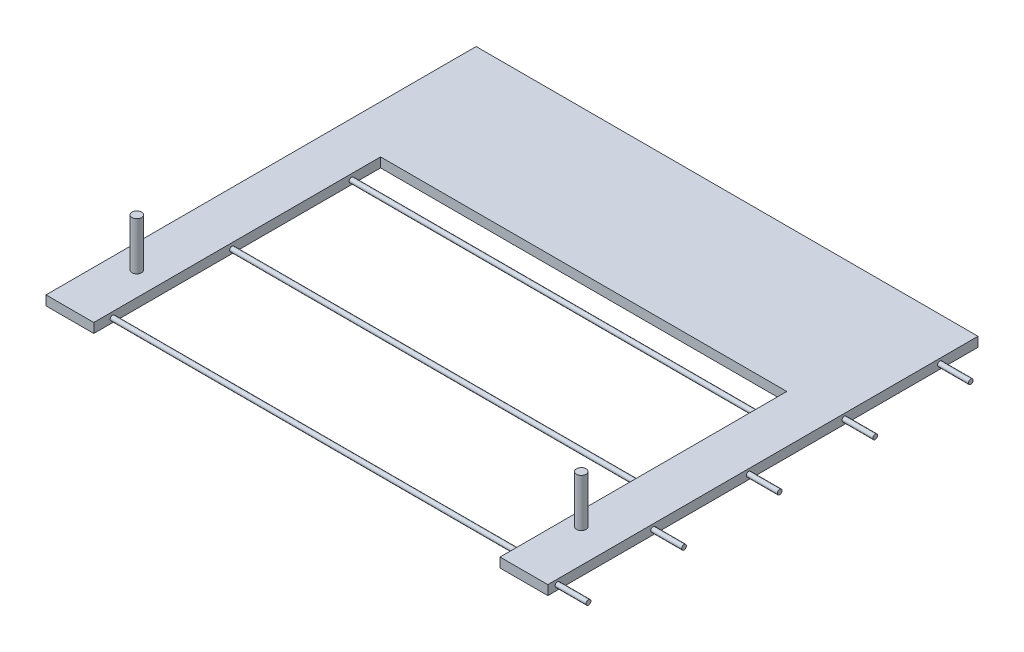
ISO-10303-21;
HEADER;
FILE_DESCRIPTION(('STEP AP214'),'2;1');
FILE_NAME('part.step','',(''),(''),'','','');
FILE_SCHEMA(('AUTOMOTIVE_DESIGN { 1 0 10303 214 1 1 1 1 }'));
ENDSEC;
DATA;
#1=APPLICATION_CONTEXT('core data for automotive mechanical design processes');
#2=APPLICATION_PROTOCOL_DEFINITION('international standard','automotive_design',2000,#1);
#3=PRODUCT_CONTEXT('',#1,'mechanical');
#4=PRODUCT('Part','Part','',(#3));
#5=PRODUCT_RELATED_PRODUCT_CATEGORY('part','',(#4));
#6=PRODUCT_DEFINITION_FORMATION('','',#4);
#7=PRODUCT_DEFINITION_CONTEXT('part definition',#1,'design');
#8=PRODUCT_DEFINITION('design','',#6,#7);
#9=PRODUCT_DEFINITION_SHAPE('','',#8);
#10=(LENGTH_UNIT() NAMED_UNIT(*) SI_UNIT(.MILLI.,.METRE.));
#11=(NAMED_UNIT(*) PLANE_ANGLE_UNIT() SI_UNIT($,.RADIAN.));
#12=(NAMED_UNIT(*) SI_UNIT($,.STERADIAN.) SOLID_ANGLE_UNIT());
#13=UNCERTAINTY_MEASURE_WITH_UNIT(LENGTH_MEASURE(1.E-05),#10,'distance_accuracy_value','');
#14=(GEOMETRIC_REPRESENTATION_CONTEXT(3) GLOBAL_UNCERTAINTY_ASSIGNED_CONTEXT((#13)) GLOBAL_UNIT_ASSIGNED_CONTEXT((#10,
#11,#12)) REPRESENTATION_CONTEXT('',''));
#15=CARTESIAN_POINT('',(0.,0.,0.));
#16=DIRECTION('',(0.,0.,1.));
#17=DIRECTION('',(1.,0.,0.));
#18=AXIS2_PLACEMENT_3D('',#15,#16,#17);
#19=CARTESIAN_POINT('',(-52.5,2.,50.));
#20=DIRECTION('',(0.,0.,-1.));
#21=DIRECTION('',(-1.,0.,0.));
#22=AXIS2_PLACEMENT_3D('',#19,#20,#21);
#23=PLANE('',#22);
#24=DIRECTION('',(0.,1.,0.));
#25=VECTOR('',#24,1.);
#26=CARTESIAN_POINT('',(-42.5,0.,50.));
#27=LINE('',#26,#25);
#28=CARTESIAN_POINT('',(-42.5,0.,50.));
#29=VERTEX_POINT('',#28);
#30=CARTESIAN_POINT('',(-42.5,2.,50.));
#31=VERTEX_POINT('',#30);
#32=EDGE_CURVE('E196',#29,#31,#27,.T.);
#33=ORIENTED_EDGE('',*,*,#32,.T.);
#34=DIRECTION('',(1.,0.,0.));
#35=VECTOR('',#34,1.);
#36=CARTESIAN_POINT('',(-52.5,2.,50.));
#37=LINE('',#36,#35);
#38=CARTESIAN_POINT('',(-52.5,2.,50.));
#39=VERTEX_POINT('',#38);
#40=EDGE_CURVE('E129',#39,#31,#37,.T.);
#41=ORIENTED_EDGE('',*,*,#40,.F.);
#42=DIRECTION('',(0.,-1.,0.));
#43=VECTOR('',#42,1.);
#44=CARTESIAN_POINT('',(-52.5,2.,50.));
#45=LINE('',#44,#43);
#46=CARTESIAN_POINT('',(-52.5,0.,50.));
#47=VERTEX_POINT('',#46);
#48=EDGE_CURVE('E110',#39,#47,#45,.T.);
#49=ORIENTED_EDGE('',*,*,#48,.T.);
#50=DIRECTION('',(1.,0.,0.));
#51=VECTOR('',#50,1.);
#52=CARTESIAN_POINT('',(-52.5,0.,50.));
#53=LINE('',#52,#51);
#54=EDGE_CURVE('E131',#47,#29,#53,.T.);
#55=ORIENTED_EDGE('',*,*,#54,.T.);
#56=EDGE_LOOP('',(#33,#41,#49,#55));
#57=FACE_BOUND('',#56,.T.);
#58=ADVANCED_FACE('F39',(#57),#23,.F.);
#59=CARTESIAN_POINT('',(0.,2.,0.));
#60=DIRECTION('',(0.,1.,0.));
#61=DIRECTION('',(0.,0.,1.));
#62=AXIS2_PLACEMENT_3D('',#59,#60,#61);
#63=PLANE('',#62);
#64=DIRECTION('',(1.,0.,0.));
#65=VECTOR('',#64,1.);
#66=CARTESIAN_POINT('',(0.,2.,-40.));
#67=LINE('',#66,#65);
#68=CARTESIAN_POINT('',(-52.5,2.,-40.));
#69=VERTEX_POINT('',#68);
#70=CARTESIAN_POINT('',(52.5,2.,-40.));
#71=VERTEX_POINT('',#70);
#72=EDGE_CURVE('E104',#69,#71,#67,.T.);
#73=ORIENTED_EDGE('',*,*,#72,.F.);
#74=DIRECTION('',(0.,0.,1.));
#75=VECTOR('',#74,1.);
#76=CARTESIAN_POINT('',(-52.5,2.,-50.));
#77=LINE('',#76,#75);
#78=EDGE_CURVE('E117',#69,#39,#77,.T.);
#79=ORIENTED_EDGE('',*,*,#78,.T.);
#80=ORIENTED_EDGE('',*,*,#40,.T.);
#81=DIRECTION('',(0.,0.,-1.));
#82=VECTOR('',#81,1.);
#83=CARTESIAN_POINT('',(-42.5,2.,50.));
#84=LINE('',#83,#82);
#85=CARTESIAN_POINT('',(-42.5,2.,-10.));
#86=VERTEX_POINT('',#85);
#87=EDGE_CURVE('E187',#31,#86,#84,.T.);
#88=ORIENTED_EDGE('',*,*,#87,.T.);
#89=DIRECTION('',(1.,0.,0.));
#90=VECTOR('',#89,1.);
#91=CARTESIAN_POINT('',(-42.5,2.,-10.));
#92=LINE('',#91,#90);
#93=CARTESIAN_POINT('',(42.5,2.,-10.));
#94=VERTEX_POINT('',#93);
#95=EDGE_CURVE('E184',#86,#94,#92,.T.);
#96=ORIENTED_EDGE('',*,*,#95,.T.);
#97=DIRECTION('',(0.,0.,-1.));
#98=VECTOR('',#97,1.);
#99=CARTESIAN_POINT('',(42.5,2.,50.));
#100=LINE('',#99,#98);
#101=CARTESIAN_POINT('',(42.5,2.,50.));
#102=VERTEX_POINT('',#101);
#103=EDGE_CURVE('E178',#102,#94,#100,.T.);
#104=ORIENTED_EDGE('',*,*,#103,.F.);
#105=CARTESIAN_POINT('',(52.5,2.,50.));
#106=VERTEX_POINT('',#105);
#107=EDGE_CURVE('E127',#102,#106,#37,.T.);
#108=ORIENTED_EDGE('',*,*,#107,.T.);
#109=DIRECTION('',(0.,0.,-1.));
#110=VECTOR('',#109,1.);
#111=CARTESIAN_POINT('',(52.5,2.,-50.));
#112=LINE('',#111,#110);
#113=EDGE_CURVE('E120',#106,#71,#112,.T.);
#114=ORIENTED_EDGE('',*,*,#113,.T.);
#115=EDGE_LOOP('',(#73,#79,#80,#88,#96,#104,#108,#114));
#116=FACE_BOUND('',#115,.T.);
#117=CARTESIAN_POINT('',(-47.5,2.,36.));
#118=DIRECTION('',(0.,1.,0.));
#119=DIRECTION('',(0.,0.,1.));
#120=AXIS2_PLACEMENT_3D('',#117,#118,#119);
#121=CIRCLE('',#120,0.999999999999998);
#122=CARTESIAN_POINT('',(-47.5,2.,37.));
#123=VERTEX_POINT('',#122);
#124=EDGE_CURVE('E217',#123,#123,#121,.T.);
#125=ORIENTED_EDGE('',*,*,#124,.F.);
#126=EDGE_LOOP('',(#125));
#127=FACE_BOUND('',#126,.T.);
#128=CARTESIAN_POINT('',(45.5,2.,36.0000000000002));
#129=DIRECTION('',(0.,1.,0.));
#130=DIRECTION('',(0.,0.,1.));
#131=AXIS2_PLACEMENT_3D('',#128,#129,#130);
#132=CIRCLE('',#131,0.999999999999998);
#133=CARTESIAN_POINT('',(45.5,2.,37.0000000000002));
#134=VERTEX_POINT('',#133);
#135=EDGE_CURVE('E214',#134,#134,#132,.T.);
#136=ORIENTED_EDGE('',*,*,#135,.F.);
#137=EDGE_LOOP('',(#136));
#138=FACE_BOUND('',#137,.T.);
#139=ADVANCED_FACE('F114',(#116,#127,#138),#63,.T.);
#140=CARTESIAN_POINT('',(0.,0.,0.));
#141=DIRECTION('',(0.,1.,0.));
#142=DIRECTION('',(0.,0.,1.));
#143=AXIS2_PLACEMENT_3D('',#140,#141,#142);
#144=PLANE('',#143);
#145=DIRECTION('',(0.,0.,1.));
#146=VECTOR('',#145,1.);
#147=CARTESIAN_POINT('',(-52.5,0.,-50.));
#148=LINE('',#147,#146);
#149=CARTESIAN_POINT('',(-52.5,0.,-40.));
#150=VERTEX_POINT('',#149);
#151=EDGE_CURVE('E139',#150,#47,#148,.T.);
#152=ORIENTED_EDGE('',*,*,#151,.F.);
#153=DIRECTION('',(1.,0.,0.));
#154=VECTOR('',#153,1.);
#155=CARTESIAN_POINT('',(0.,0.,-40.));
#156=LINE('',#155,#154);
#157=CARTESIAN_POINT('',(52.5,0.,-40.));
#158=VERTEX_POINT('',#157);
#159=EDGE_CURVE('E54',#150,#158,#156,.T.);
#160=ORIENTED_EDGE('',*,*,#159,.T.);
#161=DIRECTION('',(0.,0.,-1.));
#162=VECTOR('',#161,1.);
#163=CARTESIAN_POINT('',(52.5,0.,-50.));
#164=LINE('',#163,#162);
#165=CARTESIAN_POINT('',(52.5,0.,50.));
#166=VERTEX_POINT('',#165);
#167=EDGE_CURVE('E136',#166,#158,#164,.T.);
#168=ORIENTED_EDGE('',*,*,#167,.F.);
#169=CARTESIAN_POINT('',(42.5,0.,50.));
#170=VERTEX_POINT('',#169);
#171=EDGE_CURVE('E142',#170,#166,#53,.T.);
#172=ORIENTED_EDGE('',*,*,#171,.F.);
#173=DIRECTION('',(0.,0.,-1.));
#174=VECTOR('',#173,1.);
#175=CARTESIAN_POINT('',(42.5,0.,50.));
#176=LINE('',#175,#174);
#177=CARTESIAN_POINT('',(42.5,0.,-10.));
#178=VERTEX_POINT('',#177);
#179=EDGE_CURVE('E199',#170,#178,#176,.T.);
#180=ORIENTED_EDGE('',*,*,#179,.T.);
#181=DIRECTION('',(1.,0.,0.));
#182=VECTOR('',#181,1.);
#183=CARTESIAN_POINT('',(-42.5,0.,-10.));
#184=LINE('',#183,#182);
#185=CARTESIAN_POINT('',(-42.5,0.,-10.));
#186=VERTEX_POINT('',#185);
#187=EDGE_CURVE('E205',#186,#178,#184,.T.);
#188=ORIENTED_EDGE('',*,*,#187,.F.);
#189=DIRECTION('',(0.,0.,-1.));
#190=VECTOR('',#189,1.);
#191=CARTESIAN_POINT('',(-42.5,0.,50.));
#192=LINE('',#191,#190);
#193=EDGE_CURVE('E183',#29,#186,#192,.T.);
#194=ORIENTED_EDGE('',*,*,#193,.F.);
#195=ORIENTED_EDGE('',*,*,#54,.F.);
#196=EDGE_LOOP('',(#152,#160,#168,#172,#180,#188,#194,#195));
#197=FACE_BOUND('',#196,.T.);
#198=ADVANCED_FACE('F208',(#197),#144,.F.);
#199=CARTESIAN_POINT('',(52.5,2.,-50.));
#200=DIRECTION('',(-1.,0.,0.));
#201=DIRECTION('',(0.,0.,1.));
#202=AXIS2_PLACEMENT_3D('',#199,#200,#201);
#203=PLANE('',#202);
#204=CARTESIAN_POINT('',(52.5,1.,-32.0279323631784));
#205=DIRECTION('',(-1.,0.,0.));
#206=DIRECTION('',(0.,0.,1.));
#207=AXIS2_PLACEMENT_3D('',#204,#205,#206);
#208=CIRCLE('',#207,0.499999999999999);
#209=CARTESIAN_POINT('',(52.5,1.,-31.5279323631784));
#210=VERTEX_POINT('',#209);
#211=EDGE_CURVE('E159',#210,#210,#208,.F.);
#212=ORIENTED_EDGE('',*,*,#211,.F.);
#213=EDGE_LOOP('',(#212));
#214=FACE_BOUND('',#213,.T.);
#215=CARTESIAN_POINT('',(52.5,1.,-12.0279323631784));
#216=DIRECTION('',(-1.,0.,0.));
#217=DIRECTION('',(0.,0.,1.));
#218=AXIS2_PLACEMENT_3D('',#215,#216,#217);
#219=CIRCLE('',#218,0.499999999999999);
#220=CARTESIAN_POINT('',(52.5,1.,-11.5279323631784));
#221=VERTEX_POINT('',#220);
#222=EDGE_CURVE('E156',#221,#221,#219,.F.);
#223=ORIENTED_EDGE('',*,*,#222,.F.);
#224=EDGE_LOOP('',(#223));
#225=FACE_BOUND('',#224,.T.);
#226=CARTESIAN_POINT('',(52.5,1.,7.97206763682163));
#227=DIRECTION('',(-1.,0.,0.));
#228=DIRECTION('',(0.,0.,1.));
#229=AXIS2_PLACEMENT_3D('',#226,#227,#228);
#230=CIRCLE('',#229,0.5);
#231=CARTESIAN_POINT('',(52.5,1.,8.47206763682163));
#232=VERTEX_POINT('',#231);
#233=EDGE_CURVE('E153',#232,#232,#230,.F.);
#234=ORIENTED_EDGE('',*,*,#233,.F.);
#235=EDGE_LOOP('',(#234));
#236=FACE_BOUND('',#235,.T.);
#237=CARTESIAN_POINT('',(52.5,1.,27.9720676368216));
#238=DIRECTION('',(-1.,0.,0.));
#239=DIRECTION('',(0.,0.,1.));
#240=AXIS2_PLACEMENT_3D('',#237,#238,#239);
#241=CIRCLE('',#240,0.499999999999999);
#242=CARTESIAN_POINT('',(52.5,1.,28.4720676368216));
#243=VERTEX_POINT('',#242);
#244=EDGE_CURVE('E150',#243,#243,#241,.F.);
#245=ORIENTED_EDGE('',*,*,#244,.F.);
#246=EDGE_LOOP('',(#245));
#247=FACE_BOUND('',#246,.T.);
#248=CARTESIAN_POINT('',(52.5,1.,47.9720676368216));
#249=DIRECTION('',(-1.,0.,0.));
#250=DIRECTION('',(0.,0.,1.));
#251=AXIS2_PLACEMENT_3D('',#248,#249,#250);
#252=CIRCLE('',#251,0.499999999999999);
#253=CARTESIAN_POINT('',(52.5,1.,48.4720676368216));
#254=VERTEX_POINT('',#253);
#255=EDGE_CURVE('E109',#254,#254,#252,.F.);
#256=ORIENTED_EDGE('',*,*,#255,.F.);
#257=EDGE_LOOP('',(#256));
#258=FACE_BOUND('',#257,.T.);
#259=ORIENTED_EDGE('',*,*,#167,.T.);
#260=DIRECTION('',(0.,1.,0.));
#261=VECTOR('',#260,1.);
#262=CARTESIAN_POINT('',(52.5,-8.,-40.));
#263=LINE('',#262,#261);
#264=EDGE_CURVE('E121',#158,#71,#263,.T.);
#265=ORIENTED_EDGE('',*,*,#264,.T.);
#266=ORIENTED_EDGE('',*,*,#113,.F.);
#267=DIRECTION('',(0.,-1.,0.));
#268=VECTOR('',#267,1.);
#269=CARTESIAN_POINT('',(52.5,2.,50.));
#270=LINE('',#269,#268);
#271=EDGE_CURVE('E135',#106,#166,#270,.T.);
#272=ORIENTED_EDGE('',*,*,#271,.T.);
#273=EDGE_LOOP('',(#259,#265,#266,#272));
#274=FACE_BOUND('',#273,.T.);
#275=ADVANCED_FACE('F41',(#214,#225,#236,#247,#258,#274),#203,.F.);
#276=CARTESIAN_POINT('',(-52.5,2.,-50.));
#277=DIRECTION('',(1.,0.,0.));
#278=DIRECTION('',(0.,0.,-1.));
#279=AXIS2_PLACEMENT_3D('',#276,#277,#278);
#280=PLANE('',#279);
#281=ORIENTED_EDGE('',*,*,#78,.F.);
#282=DIRECTION('',(0.,-1.,0.));
#283=VECTOR('',#282,1.);
#284=CARTESIAN_POINT('',(-52.5,2.,-40.));
#285=LINE('',#284,#283);
#286=EDGE_CURVE('E101',#69,#150,#285,.T.);
#287=ORIENTED_EDGE('',*,*,#286,.T.);
#288=ORIENTED_EDGE('',*,*,#151,.T.);
#289=ORIENTED_EDGE('',*,*,#48,.F.);
#290=EDGE_LOOP('',(#281,#287,#288,#289));
#291=FACE_BOUND('',#290,.T.);
#292=ADVANCED_FACE('F124',(#291),#280,.F.);
#293=ORIENTED_EDGE('',*,*,#107,.F.);
#294=DIRECTION('',(0.,1.,0.));
#295=VECTOR('',#294,1.);
#296=CARTESIAN_POINT('',(42.5,0.,50.));
#297=LINE('',#296,#295);
#298=EDGE_CURVE('E181',#170,#102,#297,.T.);
#299=ORIENTED_EDGE('',*,*,#298,.F.);
#300=ORIENTED_EDGE('',*,*,#171,.T.);
#301=ORIENTED_EDGE('',*,*,#271,.F.);
#302=EDGE_LOOP('',(#293,#299,#300,#301));
#303=FACE_BOUND('',#302,.T.);
#304=ADVANCED_FACE('F256',(#303),#23,.F.);
#305=CARTESIAN_POINT('',(-42.5,0.,50.));
#306=DIRECTION('',(1.,0.,0.));
#307=DIRECTION('',(0.,0.,-1.));
#308=AXIS2_PLACEMENT_3D('',#305,#306,#307);
#309=PLANE('',#308);
#310=CARTESIAN_POINT('',(-42.5,0.87507701275058,-3.9177839565518));
#311=DIRECTION('',(1.,0.,0.));
#312=DIRECTION('',(0.,0.,-1.));
#313=AXIS2_PLACEMENT_3D('',#310,#311,#312);
#314=CIRCLE('',#313,0.499999999999999);
#315=CARTESIAN_POINT('',(-42.5,0.87507701275058,-4.4177839565518));
#316=VERTEX_POINT('',#315);
#317=EDGE_CURVE('E247',#316,#316,#314,.T.);
#318=ORIENTED_EDGE('',*,*,#317,.F.);
#319=EDGE_LOOP('',(#318));
#320=FACE_BOUND('',#319,.T.);
#321=CARTESIAN_POINT('',(-42.5,0.87507701275058,21.0822160434482));
#322=DIRECTION('',(1.,0.,0.));
#323=DIRECTION('',(0.,0.,-1.));
#324=AXIS2_PLACEMENT_3D('',#321,#322,#323);
#325=CIRCLE('',#324,0.499999999999999);
#326=CARTESIAN_POINT('',(-42.5,0.87507701275058,20.5822160434482));
#327=VERTEX_POINT('',#326);
#328=EDGE_CURVE('E244',#327,#327,#325,.T.);
#329=ORIENTED_EDGE('',*,*,#328,.F.);
#330=EDGE_LOOP('',(#329));
#331=FACE_BOUND('',#330,.T.);
#332=CARTESIAN_POINT('',(-42.5,0.87507701275058,46.0822160434482));
#333=DIRECTION('',(1.,0.,0.));
#334=DIRECTION('',(0.,0.,-1.));
#335=AXIS2_PLACEMENT_3D('',#332,#333,#334);
#336=CIRCLE('',#335,0.499999999999999);
#337=CARTESIAN_POINT('',(-42.5,0.87507701275058,45.5822160434482));
#338=VERTEX_POINT('',#337);
#339=EDGE_CURVE('E241',#338,#338,#336,.T.);
#340=ORIENTED_EDGE('',*,*,#339,.F.);
#341=EDGE_LOOP('',(#340));
#342=FACE_BOUND('',#341,.T.);
#343=ORIENTED_EDGE('',*,*,#87,.F.);
#344=ORIENTED_EDGE('',*,*,#32,.F.);
#345=ORIENTED_EDGE('',*,*,#193,.T.);
#346=DIRECTION('',(0.,1.,0.));
#347=VECTOR('',#346,1.);
#348=CARTESIAN_POINT('',(-42.5,0.,-10.));
#349=LINE('',#348,#347);
#350=EDGE_CURVE('E140',#186,#86,#349,.T.);
#351=ORIENTED_EDGE('',*,*,#350,.T.);
#352=EDGE_LOOP('',(#343,#344,#345,#351));
#353=FACE_BOUND('',#352,.T.);
#354=ADVANCED_FACE('F202',(#320,#331,#342,#353),#309,.T.);
#355=CARTESIAN_POINT('',(-42.5,0.,-10.));
#356=DIRECTION('',(0.,0.,1.));
#357=DIRECTION('',(1.,0.,0.));
#358=AXIS2_PLACEMENT_3D('',#355,#356,#357);
#359=PLANE('',#358);
#360=ORIENTED_EDGE('',*,*,#95,.F.);
#361=ORIENTED_EDGE('',*,*,#350,.F.);
#362=ORIENTED_EDGE('',*,*,#187,.T.);
#363=DIRECTION('',(0.,1.,0.));
#364=VECTOR('',#363,1.);
#365=CARTESIAN_POINT('',(42.5,0.,-10.));
#366=LINE('',#365,#364);
#367=EDGE_CURVE('E62',#178,#94,#366,.T.);
#368=ORIENTED_EDGE('',*,*,#367,.T.);
#369=EDGE_LOOP('',(#360,#361,#362,#368));
#370=FACE_BOUND('',#369,.T.);
#371=ADVANCED_FACE('F173',(#370),#359,.T.);
#372=CARTESIAN_POINT('',(42.5,0.,50.));
#373=DIRECTION('',(1.,0.,0.));
#374=DIRECTION('',(0.,0.,-1.));
#375=AXIS2_PLACEMENT_3D('',#372,#373,#374);
#376=PLANE('',#375);
#377=CARTESIAN_POINT('',(42.5,0.87507701275058,-3.9177839565518));
#378=DIRECTION('',(1.,0.,0.));
#379=DIRECTION('',(0.,0.,-1.));
#380=AXIS2_PLACEMENT_3D('',#377,#378,#379);
#381=CIRCLE('',#380,0.499999999999999);
#382=CARTESIAN_POINT('',(42.5,0.87507701275058,-4.4177839565518));
#383=VERTEX_POINT('',#382);
#384=EDGE_CURVE('E11',#383,#383,#381,.F.);
#385=ORIENTED_EDGE('',*,*,#384,.F.);
#386=EDGE_LOOP('',(#385));
#387=FACE_BOUND('',#386,.T.);
#388=CARTESIAN_POINT('',(42.5,0.87507701275058,21.0822160434482));
#389=DIRECTION('',(1.,0.,0.));
#390=DIRECTION('',(0.,0.,-1.));
#391=AXIS2_PLACEMENT_3D('',#388,#389,#390);
#392=CIRCLE('',#391,0.499999999999999);
#393=CARTESIAN_POINT('',(42.5,0.87507701275058,20.5822160434482));
#394=VERTEX_POINT('',#393);
#395=EDGE_CURVE('E47',#394,#394,#392,.F.);
#396=ORIENTED_EDGE('',*,*,#395,.F.);
#397=EDGE_LOOP('',(#396));
#398=FACE_BOUND('',#397,.T.);
#399=CARTESIAN_POINT('',(42.5,0.87507701275058,46.0822160434482));
#400=DIRECTION('',(1.,0.,0.));
#401=DIRECTION('',(0.,0.,-1.));
#402=AXIS2_PLACEMENT_3D('',#399,#400,#401);
#403=CIRCLE('',#402,0.499999999999999);
#404=CARTESIAN_POINT('',(42.5,0.87507701275058,45.5822160434482));
#405=VERTEX_POINT('',#404);
#406=EDGE_CURVE('E162',#405,#405,#403,.F.);
#407=ORIENTED_EDGE('',*,*,#406,.F.);
#408=EDGE_LOOP('',(#407));
#409=FACE_BOUND('',#408,.T.);
#410=ORIENTED_EDGE('',*,*,#103,.T.);
#411=ORIENTED_EDGE('',*,*,#367,.F.);
#412=ORIENTED_EDGE('',*,*,#179,.F.);
#413=ORIENTED_EDGE('',*,*,#298,.T.);
#414=EDGE_LOOP('',(#410,#411,#412,#413));
#415=FACE_BOUND('',#414,.T.);
#416=ADVANCED_FACE('F169',(#387,#398,#409,#415),#376,.F.);
#417=CARTESIAN_POINT('',(45.5,12.,36.0000000000002));
#418=DIRECTION('',(0.,-1.,0.));
#419=DIRECTION('',(0.,0.,-1.));
#420=AXIS2_PLACEMENT_3D('',#417,#418,#419);
#421=CYLINDRICAL_SURFACE('',#420,0.999999999999998);
#422=CARTESIAN_POINT('',(45.5,12.,36.0000000000002));
#423=DIRECTION('',(0.,1.,0.));
#424=DIRECTION('',(0.,0.,1.));
#425=AXIS2_PLACEMENT_3D('',#422,#423,#424);
#426=CIRCLE('',#425,0.999999999999998);
#427=CARTESIAN_POINT('',(45.5,12.,37.0000000000002));
#428=VERTEX_POINT('',#427);
#429=EDGE_CURVE('E192',#428,#428,#426,.T.);
#430=ORIENTED_EDGE('',*,*,#429,.F.);
#431=EDGE_LOOP('',(#430));
#432=FACE_BOUND('',#431,.T.);
#433=ORIENTED_EDGE('',*,*,#135,.T.);
#434=EDGE_LOOP('',(#433));
#435=FACE_BOUND('',#434,.T.);
#436=ADVANCED_FACE('F172',(#432,#435),#421,.T.);
#437=CARTESIAN_POINT('',(45.5,12.,36.0000000000002));
#438=DIRECTION('',(0.,1.,0.));
#439=DIRECTION('',(0.,0.,1.));
#440=AXIS2_PLACEMENT_3D('',#437,#438,#439);
#441=PLANE('',#440);
#442=ORIENTED_EDGE('',*,*,#429,.T.);
#443=EDGE_LOOP('',(#442));
#444=FACE_BOUND('',#443,.T.);
#445=ADVANCED_FACE('F331',(#444),#441,.T.);
#446=CARTESIAN_POINT('',(-47.5,12.,36.));
#447=DIRECTION('',(0.,-1.,0.));
#448=DIRECTION('',(0.,0.,-1.));
#449=AXIS2_PLACEMENT_3D('',#446,#447,#448);
#450=CYLINDRICAL_SURFACE('',#449,0.999999999999998);
#451=CARTESIAN_POINT('',(-47.5,12.,36.));
#452=DIRECTION('',(0.,1.,0.));
#453=DIRECTION('',(0.,0.,1.));
#454=AXIS2_PLACEMENT_3D('',#451,#452,#453);
#455=CIRCLE('',#454,0.999999999999998);
#456=CARTESIAN_POINT('',(-47.5,12.,37.));
#457=VERTEX_POINT('',#456);
#458=EDGE_CURVE('E220',#457,#457,#455,.T.);
#459=ORIENTED_EDGE('',*,*,#458,.F.);
#460=EDGE_LOOP('',(#459));
#461=FACE_BOUND('',#460,.T.);
#462=ORIENTED_EDGE('',*,*,#124,.T.);
#463=EDGE_LOOP('',(#462));
#464=FACE_BOUND('',#463,.T.);
#465=ADVANCED_FACE('F328',(#461,#464),#450,.T.);
#466=CARTESIAN_POINT('',(-47.5,12.,36.));
#467=DIRECTION('',(0.,1.,0.));
#468=DIRECTION('',(0.,0.,1.));
#469=AXIS2_PLACEMENT_3D('',#466,#467,#468);
#470=PLANE('',#469);
#471=ORIENTED_EDGE('',*,*,#458,.T.);
#472=EDGE_LOOP('',(#471));
#473=FACE_BOUND('',#472,.T.);
#474=ADVANCED_FACE('F324',(#473),#470,.T.);
#475=CARTESIAN_POINT('',(0.,-8.,-40.));
#476=DIRECTION('',(0.,0.,1.));
#477=DIRECTION('',(1.,0.,0.));
#478=AXIS2_PLACEMENT_3D('',#475,#476,#477);
#479=PLANE('',#478);
#480=ORIENTED_EDGE('',*,*,#286,.F.);
#481=ORIENTED_EDGE('',*,*,#72,.T.);
#482=ORIENTED_EDGE('',*,*,#264,.F.);
#483=ORIENTED_EDGE('',*,*,#159,.F.);
#484=EDGE_LOOP('',(#480,#481,#482,#483));
#485=FACE_BOUND('',#484,.T.);
#486=ADVANCED_FACE('F103',(#485),#479,.F.);
#487=CARTESIAN_POINT('',(60.3867084621939,1.,47.9720676368216));
#488=DIRECTION('',(-1.,0.,0.));
#489=DIRECTION('',(0.,0.,1.));
#490=AXIS2_PLACEMENT_3D('',#487,#488,#489);
#491=CYLINDRICAL_SURFACE('',#490,0.499999999999999);
#492=CARTESIAN_POINT('',(58.9724948998208,1.,47.9720676368216));
#493=DIRECTION('',(-1.,0.,0.));
#494=DIRECTION('',(0.,0.,1.));
#495=AXIS2_PLACEMENT_3D('',#492,#493,#494);
#496=CIRCLE('',#495,0.499999999999999);
#497=CARTESIAN_POINT('',(58.9724948998208,1.,48.4720676368216));
#498=VERTEX_POINT('',#497);
#499=EDGE_CURVE('E122',#498,#498,#496,.T.);
#500=ORIENTED_EDGE('',*,*,#499,.T.);
#501=EDGE_LOOP('',(#500));
#502=FACE_BOUND('',#501,.T.);
#503=ORIENTED_EDGE('',*,*,#255,.T.);
#504=EDGE_LOOP('',(#503));
#505=FACE_BOUND('',#504,.T.);
#506=ADVANCED_FACE('F313',(#502,#505),#491,.T.);
#507=CARTESIAN_POINT('',(58.9724948998208,-127.878307559228,-39.059952042417));
#508=DIRECTION('',(-1.,0.,0.));
#509=DIRECTION('',(0.,0.,1.));
#510=AXIS2_PLACEMENT_3D('',#507,#508,#509);
#511=PLANE('',#510);
#512=ORIENTED_EDGE('',*,*,#499,.F.);
#513=EDGE_LOOP('',(#512));
#514=FACE_BOUND('',#513,.T.);
#515=ADVANCED_FACE('F315',(#514),#511,.F.);
#516=CARTESIAN_POINT('',(60.3867084621939,1.,27.9720676368216));
#517=DIRECTION('',(-1.,0.,0.));
#518=DIRECTION('',(0.,0.,1.));
#519=AXIS2_PLACEMENT_3D('',#516,#517,#518);
#520=CYLINDRICAL_SURFACE('',#519,0.499999999999999);
#521=CARTESIAN_POINT('',(58.9724948998208,1.,27.9720676368216));
#522=DIRECTION('',(-1.,0.,0.));
#523=DIRECTION('',(0.,0.,1.));
#524=AXIS2_PLACEMENT_3D('',#521,#522,#523);
#525=CIRCLE('',#524,0.499999999999999);
#526=CARTESIAN_POINT('',(58.9724948998208,1.,28.4720676368216));
#527=VERTEX_POINT('',#526);
#528=EDGE_CURVE('E229',#527,#527,#525,.T.);
#529=ORIENTED_EDGE('',*,*,#528,.T.);
#530=EDGE_LOOP('',(#529));
#531=FACE_BOUND('',#530,.T.);
#532=ORIENTED_EDGE('',*,*,#244,.T.);
#533=EDGE_LOOP('',(#532));
#534=FACE_BOUND('',#533,.T.);
#535=ADVANCED_FACE('F321',(#531,#534),#520,.T.);
#536=CARTESIAN_POINT('',(58.9724948998208,-127.878307559228,-39.059952042417));
#537=DIRECTION('',(-1.,0.,0.));
#538=DIRECTION('',(0.,0.,1.));
#539=AXIS2_PLACEMENT_3D('',#536,#537,#538);
#540=PLANE('',#539);
#541=ORIENTED_EDGE('',*,*,#528,.F.);
#542=EDGE_LOOP('',(#541));
#543=FACE_BOUND('',#542,.T.);
#544=ADVANCED_FACE('F435',(#543),#540,.F.);
#545=CARTESIAN_POINT('',(60.3867084621939,1.,7.97206763682163));
#546=DIRECTION('',(-1.,0.,0.));
#547=DIRECTION('',(0.,0.,1.));
#548=AXIS2_PLACEMENT_3D('',#545,#546,#547);
#549=CYLINDRICAL_SURFACE('',#548,0.5);
#550=CARTESIAN_POINT('',(58.9724948998208,1.,7.97206763682163));
#551=DIRECTION('',(-1.,0.,0.));
#552=DIRECTION('',(0.,0.,1.));
#553=AXIS2_PLACEMENT_3D('',#550,#551,#552);
#554=CIRCLE('',#553,0.5);
#555=CARTESIAN_POINT('',(58.9724948998208,1.,8.47206763682163));
#556=VERTEX_POINT('',#555);
#557=EDGE_CURVE('E232',#556,#556,#554,.T.);
#558=ORIENTED_EDGE('',*,*,#557,.T.);
#559=EDGE_LOOP('',(#558));
#560=FACE_BOUND('',#559,.T.);
#561=ORIENTED_EDGE('',*,*,#233,.T.);
#562=EDGE_LOOP('',(#561));
#563=FACE_BOUND('',#562,.T.);
#564=ADVANCED_FACE('F440',(#560,#563),#549,.T.);
#565=CARTESIAN_POINT('',(58.9724948998208,-127.878307559228,-39.059952042417));
#566=DIRECTION('',(-1.,0.,0.));
#567=DIRECTION('',(0.,0.,1.));
#568=AXIS2_PLACEMENT_3D('',#565,#566,#567);
#569=PLANE('',#568);
#570=ORIENTED_EDGE('',*,*,#557,.F.);
#571=EDGE_LOOP('',(#570));
#572=FACE_BOUND('',#571,.T.);
#573=ADVANCED_FACE('F446',(#572),#569,.F.);
#574=CARTESIAN_POINT('',(60.3867084621939,1.,-12.0279323631784));
#575=DIRECTION('',(-1.,0.,0.));
#576=DIRECTION('',(0.,0.,1.));
#577=AXIS2_PLACEMENT_3D('',#574,#575,#576);
#578=CYLINDRICAL_SURFACE('',#577,0.499999999999999);
#579=CARTESIAN_POINT('',(58.9724948998208,1.,-12.0279323631784));
#580=DIRECTION('',(-1.,0.,0.));
#581=DIRECTION('',(0.,0.,1.));
#582=AXIS2_PLACEMENT_3D('',#579,#580,#581);
#583=CIRCLE('',#582,0.499999999999999);
#584=CARTESIAN_POINT('',(58.9724948998208,1.,-11.5279323631784));
#585=VERTEX_POINT('',#584);
#586=EDGE_CURVE('E235',#585,#585,#583,.T.);
#587=ORIENTED_EDGE('',*,*,#586,.T.);
#588=EDGE_LOOP('',(#587));
#589=FACE_BOUND('',#588,.T.);
#590=ORIENTED_EDGE('',*,*,#222,.T.);
#591=EDGE_LOOP('',(#590));
#592=FACE_BOUND('',#591,.T.);
#593=ADVANCED_FACE('F451',(#589,#592),#578,.T.);
#594=CARTESIAN_POINT('',(58.9724948998208,-127.878307559228,-39.059952042417));
#595=DIRECTION('',(-1.,0.,0.));
#596=DIRECTION('',(0.,0.,1.));
#597=AXIS2_PLACEMENT_3D('',#594,#595,#596);
#598=PLANE('',#597);
#599=ORIENTED_EDGE('',*,*,#586,.F.);
#600=EDGE_LOOP('',(#599));
#601=FACE_BOUND('',#600,.T.);
#602=ADVANCED_FACE('F458',(#601),#598,.F.);
#603=CARTESIAN_POINT('',(60.3867084621939,1.,-32.0279323631784));
#604=DIRECTION('',(-1.,0.,0.));
#605=DIRECTION('',(0.,0.,1.));
#606=AXIS2_PLACEMENT_3D('',#603,#604,#605);
#607=CYLINDRICAL_SURFACE('',#606,0.499999999999999);
#608=CARTESIAN_POINT('',(58.9724948998208,1.,-32.0279323631784));
#609=DIRECTION('',(-1.,0.,0.));
#610=DIRECTION('',(0.,0.,1.));
#611=AXIS2_PLACEMENT_3D('',#608,#609,#610);
#612=CIRCLE('',#611,0.499999999999999);
#613=CARTESIAN_POINT('',(58.9724948998208,1.,-31.5279323631784));
#614=VERTEX_POINT('',#613);
#615=EDGE_CURVE('E238',#614,#614,#612,.T.);
#616=ORIENTED_EDGE('',*,*,#615,.T.);
#617=EDGE_LOOP('',(#616));
#618=FACE_BOUND('',#617,.T.);
#619=ORIENTED_EDGE('',*,*,#211,.T.);
#620=EDGE_LOOP('',(#619));
#621=FACE_BOUND('',#620,.T.);
#622=ADVANCED_FACE('F273',(#618,#621),#607,.T.);
#623=CARTESIAN_POINT('',(58.9724948998208,-127.878307559228,-39.059952042417));
#624=DIRECTION('',(-1.,0.,0.));
#625=DIRECTION('',(0.,0.,1.));
#626=AXIS2_PLACEMENT_3D('',#623,#624,#625);
#627=PLANE('',#626);
#628=ORIENTED_EDGE('',*,*,#615,.F.);
#629=EDGE_LOOP('',(#628));
#630=FACE_BOUND('',#629,.T.);
#631=ADVANCED_FACE('F265',(#630),#627,.F.);
#632=CARTESIAN_POINT('',(43.9142135623731,0.87507701275058,46.0822160434482));
#633=DIRECTION('',(-1.,0.,0.));
#634=DIRECTION('',(0.,0.,1.));
#635=AXIS2_PLACEMENT_3D('',#632,#633,#634);
#636=CYLINDRICAL_SURFACE('',#635,0.499999999999999);
#637=ORIENTED_EDGE('',*,*,#339,.T.);
#638=EDGE_LOOP('',(#637));
#639=FACE_BOUND('',#638,.T.);
#640=ORIENTED_EDGE('',*,*,#406,.T.);
#641=EDGE_LOOP('',(#640));
#642=FACE_BOUND('',#641,.T.);
#643=ADVANCED_FACE('F262',(#639,#642),#636,.T.);
#644=CARTESIAN_POINT('',(43.9142135623731,0.87507701275058,21.0822160434482));
#645=DIRECTION('',(-1.,0.,0.));
#646=DIRECTION('',(0.,0.,1.));
#647=AXIS2_PLACEMENT_3D('',#644,#645,#646);
#648=CYLINDRICAL_SURFACE('',#647,0.499999999999999);
#649=ORIENTED_EDGE('',*,*,#328,.T.);
#650=EDGE_LOOP('',(#649));
#651=FACE_BOUND('',#650,.T.);
#652=ORIENTED_EDGE('',*,*,#395,.T.);
#653=EDGE_LOOP('',(#652));
#654=FACE_BOUND('',#653,.T.);
#655=ADVANCED_FACE('F167',(#651,#654),#648,.T.);
#656=CARTESIAN_POINT('',(43.9142135623731,0.87507701275058,-3.9177839565518));
#657=DIRECTION('',(-1.,0.,0.));
#658=DIRECTION('',(0.,0.,1.));
#659=AXIS2_PLACEMENT_3D('',#656,#657,#658);
#660=CYLINDRICAL_SURFACE('',#659,0.499999999999999);
#661=ORIENTED_EDGE('',*,*,#317,.T.);
#662=EDGE_LOOP('',(#661));
#663=FACE_BOUND('',#662,.T.);
#664=ORIENTED_EDGE('',*,*,#384,.T.);
#665=EDGE_LOOP('',(#664));
#666=FACE_BOUND('',#665,.T.);
#667=ADVANCED_FACE('F251',(#663,#666),#660,.T.);
#668=CLOSED_SHELL('',(#58,#139,#198,#275,#292,#304,#354,#371,#416,#436,#445,#465,#474,#486,#506,
#515,#535,#544,#564,#573,#593,#602,#622,#631,#643,#655,#667));
#669=MANIFOLD_SOLID_BREP('B2',#668);
#670=ADVANCED_BREP_SHAPE_REPRESENTATION('',(#18,#669),#14);
#671=SHAPE_DEFINITION_REPRESENTATION(#9,#670);
ENDSEC;
END-ISO-10303-21;
